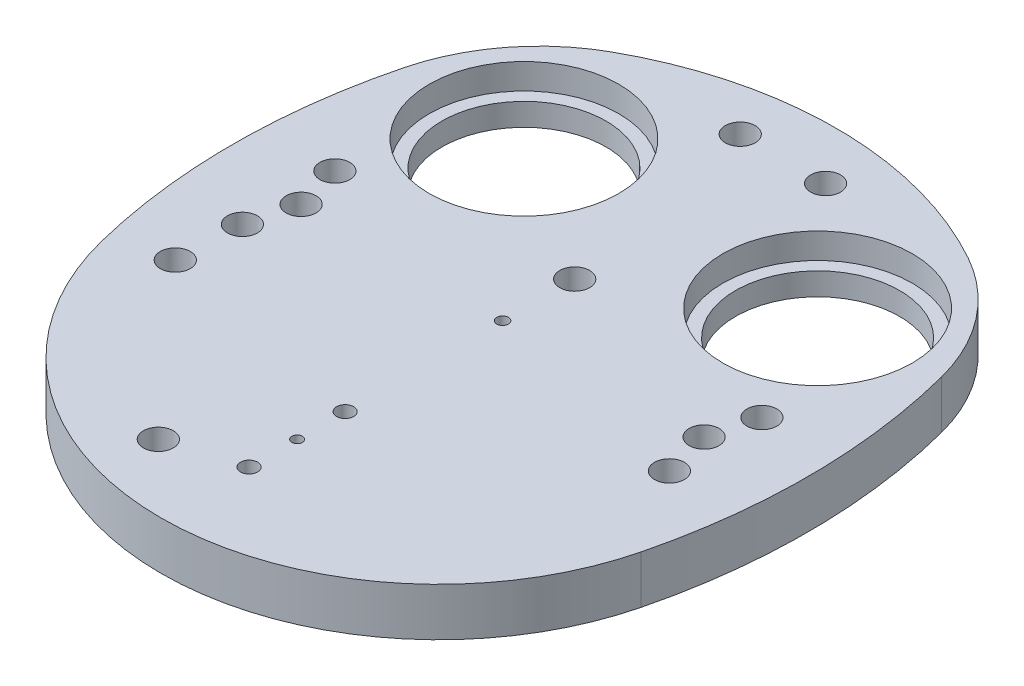
ISO-10303-21;
HEADER;
FILE_DESCRIPTION(('STEP AP214'),'2;1');
FILE_NAME('part.step','',(''),(''),'','','');
FILE_SCHEMA(('AUTOMOTIVE_DESIGN { 1 0 10303 214 1 1 1 1 }'));
ENDSEC;
DATA;
#1=APPLICATION_CONTEXT('core data for automotive mechanical design processes');
#2=APPLICATION_PROTOCOL_DEFINITION('international standard','automotive_design',2000,#1);
#3=PRODUCT_CONTEXT('',#1,'mechanical');
#4=PRODUCT('Part','Part','',(#3));
#5=PRODUCT_RELATED_PRODUCT_CATEGORY('part','',(#4));
#6=PRODUCT_DEFINITION_FORMATION('','',#4);
#7=PRODUCT_DEFINITION_CONTEXT('part definition',#1,'design');
#8=PRODUCT_DEFINITION('design','',#6,#7);
#9=PRODUCT_DEFINITION_SHAPE('','',#8);
#10=(LENGTH_UNIT() NAMED_UNIT(*) SI_UNIT(.MILLI.,.METRE.));
#11=(NAMED_UNIT(*) PLANE_ANGLE_UNIT() SI_UNIT($,.RADIAN.));
#12=(NAMED_UNIT(*) SI_UNIT($,.STERADIAN.) SOLID_ANGLE_UNIT());
#13=UNCERTAINTY_MEASURE_WITH_UNIT(LENGTH_MEASURE(1.E-05),#10,'distance_accuracy_value','');
#14=(GEOMETRIC_REPRESENTATION_CONTEXT(3) GLOBAL_UNCERTAINTY_ASSIGNED_CONTEXT((#13)) GLOBAL_UNIT_ASSIGNED_CONTEXT((#10,
#11,#12)) REPRESENTATION_CONTEXT('',''));
#15=CARTESIAN_POINT('',(0.,0.,0.));
#16=DIRECTION('',(0.,0.,1.));
#17=DIRECTION('',(1.,0.,0.));
#18=AXIS2_PLACEMENT_3D('',#15,#16,#17);
#19=CARTESIAN_POINT('',(-27.5,9.,0.));
#20=DIRECTION('',(0.,-1.,0.));
#21=DIRECTION('',(0.,0.,-1.));
#22=AXIS2_PLACEMENT_3D('',#19,#20,#21);
#23=CYLINDRICAL_SURFACE('',#22,17.75);
#24=CARTESIAN_POINT('',(-27.5,4.215,0.));
#25=DIRECTION('',(0.,1.,0.));
#26=DIRECTION('',(0.,0.,1.));
#27=AXIS2_PLACEMENT_3D('',#24,#25,#26);
#28=CIRCLE('',#27,17.75);
#29=CARTESIAN_POINT('',(-27.5,4.215,17.75));
#30=VERTEX_POINT('',#29);
#31=EDGE_CURVE('E80',#30,#30,#28,.T.);
#32=ORIENTED_EDGE('',*,*,#31,.F.);
#33=EDGE_LOOP('',(#32));
#34=FACE_BOUND('',#33,.T.);
#35=CARTESIAN_POINT('',(-27.5,9.,0.));
#36=DIRECTION('',(0.,1.,0.));
#37=DIRECTION('',(0.,0.,1.));
#38=AXIS2_PLACEMENT_3D('',#35,#36,#37);
#39=CIRCLE('',#38,17.75);
#40=CARTESIAN_POINT('',(-27.5,9.,17.75));
#41=VERTEX_POINT('',#40);
#42=EDGE_CURVE('E256',#41,#41,#39,.T.);
#43=ORIENTED_EDGE('',*,*,#42,.T.);
#44=EDGE_LOOP('',(#43));
#45=FACE_BOUND('',#44,.T.);
#46=ADVANCED_FACE('F71',(#34,#45),#23,.F.);
#47=CARTESIAN_POINT('',(27.5,9.,0.));
#48=DIRECTION('',(0.,-1.,0.));
#49=DIRECTION('',(0.,0.,-1.));
#50=AXIS2_PLACEMENT_3D('',#47,#48,#49);
#51=CYLINDRICAL_SURFACE('',#50,17.75);
#52=CARTESIAN_POINT('',(27.5,4.215,0.));
#53=DIRECTION('',(0.,1.,0.));
#54=DIRECTION('',(0.,0.,1.));
#55=AXIS2_PLACEMENT_3D('',#52,#53,#54);
#56=CIRCLE('',#55,17.75);
#57=CARTESIAN_POINT('',(27.5,4.215,17.75));
#58=VERTEX_POINT('',#57);
#59=EDGE_CURVE('E12',#58,#58,#56,.T.);
#60=ORIENTED_EDGE('',*,*,#59,.F.);
#61=EDGE_LOOP('',(#60));
#62=FACE_BOUND('',#61,.T.);
#63=CARTESIAN_POINT('',(27.5,9.,0.));
#64=DIRECTION('',(0.,1.,0.));
#65=DIRECTION('',(0.,0.,1.));
#66=AXIS2_PLACEMENT_3D('',#63,#64,#65);
#67=CIRCLE('',#66,17.75);
#68=CARTESIAN_POINT('',(27.5,9.,17.75));
#69=VERTEX_POINT('',#68);
#70=EDGE_CURVE('E261',#69,#69,#67,.T.);
#71=ORIENTED_EDGE('',*,*,#70,.T.);
#72=EDGE_LOOP('',(#71));
#73=FACE_BOUND('',#72,.T.);
#74=ADVANCED_FACE('F305',(#62,#73),#51,.F.);
#75=CARTESIAN_POINT('',(0.,9.,0.));
#76=DIRECTION('',(0.,1.,0.));
#77=DIRECTION('',(0.,0.,1.));
#78=AXIS2_PLACEMENT_3D('',#75,#76,#77);
#79=PLANE('',#78);
#80=CARTESIAN_POINT('',(0.,9.,31.5037951));
#81=DIRECTION('',(0.,1.,0.));
#82=DIRECTION('',(0.,0.,1.));
#83=AXIS2_PLACEMENT_3D('',#80,#81,#82);
#84=CIRCLE('',#83,1.1);
#85=CARTESIAN_POINT('',(0.,9.,32.6037951));
#86=VERTEX_POINT('',#85);
#87=EDGE_CURVE('E742',#86,#86,#84,.T.);
#88=ORIENTED_EDGE('',*,*,#87,.F.);
#89=EDGE_LOOP('',(#88));
#90=FACE_BOUND('',#89,.T.);
#91=CARTESIAN_POINT('',(0.,9.,79.));
#92=DIRECTION('',(0.,1.,0.));
#93=DIRECTION('',(0.,0.,1.));
#94=AXIS2_PLACEMENT_3D('',#91,#92,#93);
#95=CIRCLE('',#94,1.6);
#96=CARTESIAN_POINT('',(0.,9.,80.6));
#97=VERTEX_POINT('',#96);
#98=EDGE_CURVE('E744',#97,#97,#95,.T.);
#99=ORIENTED_EDGE('',*,*,#98,.F.);
#100=EDGE_LOOP('',(#99));
#101=FACE_BOUND('',#100,.T.);
#102=CARTESIAN_POINT('',(0.,9.,61.));
#103=DIRECTION('',(0.,1.,0.));
#104=DIRECTION('',(0.,0.,1.));
#105=AXIS2_PLACEMENT_3D('',#102,#103,#104);
#106=CIRCLE('',#105,1.6);
#107=CARTESIAN_POINT('',(0.,9.,62.6));
#108=VERTEX_POINT('',#107);
#109=EDGE_CURVE('E747',#108,#108,#106,.T.);
#110=ORIENTED_EDGE('',*,*,#109,.F.);
#111=EDGE_LOOP('',(#110));
#112=FACE_BOUND('',#111,.T.);
#113=CARTESIAN_POINT('',(0.,9.,70.));
#114=DIRECTION('',(0.,1.,0.));
#115=DIRECTION('',(0.,0.,1.));
#116=AXIS2_PLACEMENT_3D('',#113,#114,#115);
#117=CIRCLE('',#116,1.);
#118=CARTESIAN_POINT('',(0.,9.,71.));
#119=VERTEX_POINT('',#118);
#120=EDGE_CURVE('E269',#119,#119,#117,.T.);
#121=ORIENTED_EDGE('',*,*,#120,.F.);
#122=EDGE_LOOP('',(#121));
#123=FACE_BOUND('',#122,.T.);
#124=CARTESIAN_POINT('',(37.75,9.,31.5038));
#125=DIRECTION('',(0.,1.,0.));
#126=DIRECTION('',(0.,0.,-1.));
#127=AXIS2_PLACEMENT_3D('',#124,#125,#126);
#128=CIRCLE('',#127,2.8);
#129=CARTESIAN_POINT('',(37.75,9.,28.7038));
#130=VERTEX_POINT('',#129);
#131=EDGE_CURVE('E184',#130,#130,#128,.T.);
#132=ORIENTED_EDGE('',*,*,#131,.F.);
#133=EDGE_LOOP('',(#132));
#134=FACE_BOUND('',#133,.T.);
#135=CARTESIAN_POINT('',(-13.,9.,83.));
#136=DIRECTION('',(0.,1.,0.));
#137=DIRECTION('',(0.,0.,1.));
#138=AXIS2_PLACEMENT_3D('',#135,#136,#137);
#139=CIRCLE('',#138,2.8);
#140=CARTESIAN_POINT('',(-13.,9.,85.8));
#141=VERTEX_POINT('',#140);
#142=EDGE_CURVE('E209',#141,#141,#139,.T.);
#143=ORIENTED_EDGE('',*,*,#142,.F.);
#144=EDGE_LOOP('',(#143));
#145=FACE_BOUND('',#144,.T.);
#146=CARTESIAN_POINT('',(-40.5,9.,52.3285));
#147=DIRECTION('',(0.,1.,0.));
#148=DIRECTION('',(0.,0.,1.));
#149=AXIS2_PLACEMENT_3D('',#146,#147,#148);
#150=CIRCLE('',#149,2.8);
#151=CARTESIAN_POINT('',(-40.5,9.,55.1285));
#152=VERTEX_POINT('',#151);
#153=EDGE_CURVE('E203',#152,#152,#150,.T.);
#154=ORIENTED_EDGE('',*,*,#153,.F.);
#155=EDGE_LOOP('',(#154));
#156=FACE_BOUND('',#155,.T.);
#157=CARTESIAN_POINT('',(-40.,9.,40.255));
#158=DIRECTION('',(0.,1.,0.));
#159=DIRECTION('',(0.,0.,1.));
#160=AXIS2_PLACEMENT_3D('',#157,#158,#159);
#161=CIRCLE('',#160,2.8);
#162=CARTESIAN_POINT('',(-40.,9.,43.055));
#163=VERTEX_POINT('',#162);
#164=EDGE_CURVE('E197',#163,#163,#161,.T.);
#165=ORIENTED_EDGE('',*,*,#164,.F.);
#166=EDGE_LOOP('',(#165));
#167=FACE_BOUND('',#166,.T.);
#168=CARTESIAN_POINT('',(-37.75,9.,31.5038));
#169=DIRECTION('',(0.,1.,0.));
#170=DIRECTION('',(0.,0.,1.));
#171=AXIS2_PLACEMENT_3D('',#168,#169,#170);
#172=CIRCLE('',#171,2.8);
#173=CARTESIAN_POINT('',(-37.75,9.,34.3038));
#174=VERTEX_POINT('',#173);
#175=EDGE_CURVE('E196',#174,#174,#172,.T.);
#176=ORIENTED_EDGE('',*,*,#175,.F.);
#177=EDGE_LOOP('',(#176));
#178=FACE_BOUND('',#177,.T.);
#179=CARTESIAN_POINT('',(-40.,9.,22.9303));
#180=DIRECTION('',(0.,1.,0.));
#181=DIRECTION('',(0.,0.,1.));
#182=AXIS2_PLACEMENT_3D('',#179,#180,#181);
#183=CIRCLE('',#182,2.8);
#184=CARTESIAN_POINT('',(-40.,9.,25.7303));
#185=VERTEX_POINT('',#184);
#186=EDGE_CURVE('E233',#185,#185,#183,.T.);
#187=ORIENTED_EDGE('',*,*,#186,.F.);
#188=EDGE_LOOP('',(#187));
#189=FACE_BOUND('',#188,.T.);
#190=CARTESIAN_POINT('',(0.,9.,18.));
#191=DIRECTION('',(0.,1.,0.));
#192=DIRECTION('',(0.,0.,1.));
#193=AXIS2_PLACEMENT_3D('',#190,#191,#192);
#194=CIRCLE('',#193,2.8);
#195=CARTESIAN_POINT('',(0.,9.,20.8));
#196=VERTEX_POINT('',#195);
#197=EDGE_CURVE('E227',#196,#196,#194,.T.);
#198=ORIENTED_EDGE('',*,*,#197,.F.);
#199=EDGE_LOOP('',(#198));
#200=FACE_BOUND('',#199,.T.);
#201=CARTESIAN_POINT('',(40.,9.,40.255));
#202=DIRECTION('',(0.,1.,0.));
#203=DIRECTION('',(0.,0.,-1.));
#204=AXIS2_PLACEMENT_3D('',#201,#202,#203);
#205=CIRCLE('',#204,2.8);
#206=CARTESIAN_POINT('',(40.,9.,37.455));
#207=VERTEX_POINT('',#206);
#208=EDGE_CURVE('E221',#207,#207,#205,.T.);
#209=ORIENTED_EDGE('',*,*,#208,.F.);
#210=EDGE_LOOP('',(#209));
#211=FACE_BOUND('',#210,.T.);
#212=CARTESIAN_POINT('',(40.,9.,22.9303));
#213=DIRECTION('',(0.,1.,0.));
#214=DIRECTION('',(0.,0.,-1.));
#215=AXIS2_PLACEMENT_3D('',#212,#213,#214);
#216=CIRCLE('',#215,2.8);
#217=CARTESIAN_POINT('',(40.,9.,20.1303));
#218=VERTEX_POINT('',#217);
#219=EDGE_CURVE('E185',#218,#218,#216,.T.);
#220=ORIENTED_EDGE('',*,*,#219,.F.);
#221=EDGE_LOOP('',(#220));
#222=FACE_BOUND('',#221,.T.);
#223=CARTESIAN_POINT('',(8.,9.,-21.01));
#224=DIRECTION('',(0.,1.,0.));
#225=DIRECTION('',(0.,0.,-1.));
#226=AXIS2_PLACEMENT_3D('',#223,#224,#225);
#227=CIRCLE('',#226,2.8);
#228=CARTESIAN_POINT('',(8.,9.,-23.81));
#229=VERTEX_POINT('',#228);
#230=EDGE_CURVE('E174',#229,#229,#227,.T.);
#231=ORIENTED_EDGE('',*,*,#230,.F.);
#232=EDGE_LOOP('',(#231));
#233=FACE_BOUND('',#232,.T.);
#234=CARTESIAN_POINT('',(-8.,9.,-21.01));
#235=DIRECTION('',(0.,1.,0.));
#236=DIRECTION('',(0.,0.,1.));
#237=AXIS2_PLACEMENT_3D('',#234,#235,#236);
#238=CIRCLE('',#237,2.8);
#239=CARTESIAN_POINT('',(-8.,9.,-18.21));
#240=VERTEX_POINT('',#239);
#241=EDGE_CURVE('E220',#240,#240,#238,.T.);
#242=ORIENTED_EDGE('',*,*,#241,.F.);
#243=EDGE_LOOP('',(#242));
#244=FACE_BOUND('',#243,.T.);
#245=ORIENTED_EDGE('',*,*,#42,.F.);
#246=EDGE_LOOP('',(#245));
#247=FACE_BOUND('',#246,.T.);
#248=ORIENTED_EDGE('',*,*,#70,.F.);
#249=EDGE_LOOP('',(#248));
#250=FACE_BOUND('',#249,.T.);
#251=CARTESIAN_POINT('',(16.3604303599997,9.,8.27429786000026));
#252=DIRECTION('',(0.,1.,0.));
#253=DIRECTION('',(0.,0.,1.));
#254=AXIS2_PLACEMENT_3D('',#251,#252,#253);
#255=CIRCLE('',#254,35.);
#256=CARTESIAN_POINT('',(50.2516766967729,9.,-0.465463105847257));
#257=VERTEX_POINT('',#256);
#258=CARTESIAN_POINT('',(33.3942075342507,9.,-22.3010260986753));
#259=VERTEX_POINT('',#258);
#260=EDGE_CURVE('E158',#257,#259,#255,.T.);
#261=ORIENTED_EDGE('',*,*,#260,.T.);
#262=CARTESIAN_POINT('',(0.,9.,37.6409763860358));
#263=DIRECTION('',(0.,-1.,0.));
#264=DIRECTION('',(0.,0.,-1.));
#265=AXIS2_PLACEMENT_3D('',#262,#263,#264);
#266=CIRCLE('',#265,68.6164467071686);
#267=CARTESIAN_POINT('',(-33.3942075342507,9.,-22.3010260986753));
#268=VERTEX_POINT('',#267);
#269=EDGE_CURVE('E161',#268,#259,#266,.T.);
#270=ORIENTED_EDGE('',*,*,#269,.F.);
#271=CARTESIAN_POINT('',(-16.36043036,9.,8.27429786));
#272=DIRECTION('',(0.,-1.,0.));
#273=DIRECTION('',(0.,0.,-1.));
#274=AXIS2_PLACEMENT_3D('',#271,#272,#273);
#275=CIRCLE('',#274,34.9999999999996);
#276=CARTESIAN_POINT('',(-50.2516766967729,9.,-0.465463105847306));
#277=VERTEX_POINT('',#276);
#278=EDGE_CURVE('E165',#277,#268,#275,.T.);
#279=ORIENTED_EDGE('',*,*,#278,.F.);
#280=CARTESIAN_POINT('',(61.1312277841907,9.,28.2575868278222));
#281=DIRECTION('',(0.,1.,0.));
#282=DIRECTION('',(0.,0.,1.));
#283=AXIS2_PLACEMENT_3D('',#280,#281,#282);
#284=CIRCLE('',#283,115.02680126);
#285=CARTESIAN_POINT('',(-50.4907108423615,9.,56.0372165114184));
#286=VERTEX_POINT('',#285);
#287=EDGE_CURVE('E167',#277,#286,#284,.T.);
#288=ORIENTED_EDGE('',*,*,#287,.T.);
#289=CARTESIAN_POINT('',(0.,9.,43.4714676369521));
#290=DIRECTION('',(0.,1.,0.));
#291=DIRECTION('',(0.,0.,1.));
#292=AXIS2_PLACEMENT_3D('',#289,#290,#291);
#293=CIRCLE('',#292,52.03085552);
#294=CARTESIAN_POINT('',(50.4907108423616,9.,56.0372165114184));
#295=VERTEX_POINT('',#294);
#296=EDGE_CURVE('E137',#286,#295,#293,.T.);
#297=ORIENTED_EDGE('',*,*,#296,.T.);
#298=CARTESIAN_POINT('',(-61.1312277841907,9.,28.2575868278222));
#299=DIRECTION('',(0.,-1.,0.));
#300=DIRECTION('',(0.,0.,-1.));
#301=AXIS2_PLACEMENT_3D('',#298,#299,#300);
#302=CIRCLE('',#301,115.02680126);
#303=EDGE_CURVE('E170',#257,#295,#302,.T.);
#304=ORIENTED_EDGE('',*,*,#303,.F.);
#305=EDGE_LOOP('',(#261,#270,#279,#288,#297,#304));
#306=FACE_BOUND('',#305,.T.);
#307=ADVANCED_FACE('F292',(#90,#101,#112,#123,#134,#145,#156,#167,#178,#189,#200,#211,#222,#233,
#244,#247,#250,#306),#79,.T.);
#308=CARTESIAN_POINT('',(0.,0.,0.));
#309=DIRECTION('',(0.,1.,0.));
#310=DIRECTION('',(0.,0.,1.));
#311=AXIS2_PLACEMENT_3D('',#308,#309,#310);
#312=PLANE('',#311);
#313=CARTESIAN_POINT('',(0.,0.,31.5037951));
#314=DIRECTION('',(0.,1.,0.));
#315=DIRECTION('',(0.,0.,1.));
#316=AXIS2_PLACEMENT_3D('',#313,#314,#315);
#317=CIRCLE('',#316,1.1);
#318=CARTESIAN_POINT('',(0.,0.,32.6037951));
#319=VERTEX_POINT('',#318);
#320=EDGE_CURVE('E740',#319,#319,#317,.T.);
#321=ORIENTED_EDGE('',*,*,#320,.T.);
#322=EDGE_LOOP('',(#321));
#323=FACE_BOUND('',#322,.T.);
#324=CARTESIAN_POINT('',(0.,0.,70.));
#325=DIRECTION('',(0.,1.,0.));
#326=DIRECTION('',(0.,0.,1.));
#327=AXIS2_PLACEMENT_3D('',#324,#325,#326);
#328=CIRCLE('',#327,15.25);
#329=CARTESIAN_POINT('',(0.,0.,85.25));
#330=VERTEX_POINT('',#329);
#331=EDGE_CURVE('E162',#330,#330,#328,.T.);
#332=ORIENTED_EDGE('',*,*,#331,.T.);
#333=EDGE_LOOP('',(#332));
#334=FACE_BOUND('',#333,.T.);
#335=CARTESIAN_POINT('',(27.5,0.,0.));
#336=DIRECTION('',(0.,1.,0.));
#337=DIRECTION('',(0.,0.,1.));
#338=AXIS2_PLACEMENT_3D('',#335,#336,#337);
#339=CIRCLE('',#338,15.375);
#340=CARTESIAN_POINT('',(27.5,0.,15.375));
#341=VERTEX_POINT('',#340);
#342=EDGE_CURVE('E244',#341,#341,#339,.T.);
#343=ORIENTED_EDGE('',*,*,#342,.T.);
#344=EDGE_LOOP('',(#343));
#345=FACE_BOUND('',#344,.T.);
#346=CARTESIAN_POINT('',(-27.5,0.,0.));
#347=DIRECTION('',(0.,1.,0.));
#348=DIRECTION('',(0.,0.,1.));
#349=AXIS2_PLACEMENT_3D('',#346,#347,#348);
#350=CIRCLE('',#349,15.375);
#351=CARTESIAN_POINT('',(-27.5,0.,15.375));
#352=VERTEX_POINT('',#351);
#353=EDGE_CURVE('E250',#352,#352,#350,.T.);
#354=ORIENTED_EDGE('',*,*,#353,.T.);
#355=EDGE_LOOP('',(#354));
#356=FACE_BOUND('',#355,.T.);
#357=CARTESIAN_POINT('',(16.3604303599997,0.,8.27429786000026));
#358=DIRECTION('',(0.,1.,0.));
#359=DIRECTION('',(0.,0.,1.));
#360=AXIS2_PLACEMENT_3D('',#357,#358,#359);
#361=CIRCLE('',#360,35.);
#362=CARTESIAN_POINT('',(50.2516766967729,0.,-0.465463105847257));
#363=VERTEX_POINT('',#362);
#364=CARTESIAN_POINT('',(33.3942075342507,0.,-22.3010260986753));
#365=VERTEX_POINT('',#364);
#366=EDGE_CURVE('E172',#363,#365,#361,.T.);
#367=ORIENTED_EDGE('',*,*,#366,.F.);
#368=CARTESIAN_POINT('',(-61.1312277841907,0.,28.2575868278222));
#369=DIRECTION('',(0.,-1.,0.));
#370=DIRECTION('',(0.,0.,-1.));
#371=AXIS2_PLACEMENT_3D('',#368,#369,#370);
#372=CIRCLE('',#371,115.02680126);
#373=CARTESIAN_POINT('',(50.4907108423616,0.,56.0372165114184));
#374=VERTEX_POINT('',#373);
#375=EDGE_CURVE('E147',#363,#374,#372,.T.);
#376=ORIENTED_EDGE('',*,*,#375,.T.);
#377=CARTESIAN_POINT('',(0.,0.,43.4714676369521));
#378=DIRECTION('',(0.,1.,0.));
#379=DIRECTION('',(0.,0.,1.));
#380=AXIS2_PLACEMENT_3D('',#377,#378,#379);
#381=CIRCLE('',#380,52.03085552);
#382=CARTESIAN_POINT('',(-50.4907108423615,0.,56.0372165114184));
#383=VERTEX_POINT('',#382);
#384=EDGE_CURVE('E135',#383,#374,#381,.T.);
#385=ORIENTED_EDGE('',*,*,#384,.F.);
#386=CARTESIAN_POINT('',(61.1312277841907,0.,28.2575868278222));
#387=DIRECTION('',(0.,1.,0.));
#388=DIRECTION('',(0.,0.,1.));
#389=AXIS2_PLACEMENT_3D('',#386,#387,#388);
#390=CIRCLE('',#389,115.02680126);
#391=CARTESIAN_POINT('',(-50.2516766967729,0.,-0.465463105847306));
#392=VERTEX_POINT('',#391);
#393=EDGE_CURVE('E146',#392,#383,#390,.T.);
#394=ORIENTED_EDGE('',*,*,#393,.F.);
#395=CARTESIAN_POINT('',(-16.36043036,0.,8.27429786));
#396=DIRECTION('',(0.,-1.,0.));
#397=DIRECTION('',(0.,0.,-1.));
#398=AXIS2_PLACEMENT_3D('',#395,#396,#397);
#399=CIRCLE('',#398,34.9999999999996);
#400=CARTESIAN_POINT('',(-33.3942075342507,0.,-22.3010260986753));
#401=VERTEX_POINT('',#400);
#402=EDGE_CURVE('E151',#392,#401,#399,.T.);
#403=ORIENTED_EDGE('',*,*,#402,.T.);
#404=CARTESIAN_POINT('',(0.,0.,37.6409763860358));
#405=DIRECTION('',(0.,-1.,0.));
#406=DIRECTION('',(0.,0.,-1.));
#407=AXIS2_PLACEMENT_3D('',#404,#405,#406);
#408=CIRCLE('',#407,68.6164467071686);
#409=EDGE_CURVE('E125',#401,#365,#408,.T.);
#410=ORIENTED_EDGE('',*,*,#409,.T.);
#411=EDGE_LOOP('',(#367,#376,#385,#394,#403,#410));
#412=FACE_BOUND('',#411,.T.);
#413=ADVANCED_FACE('F145',(#323,#334,#345,#356,#412),#312,.F.);
#414=CARTESIAN_POINT('',(-27.5,4.215,0.));
#415=DIRECTION('',(0.,1.,0.));
#416=DIRECTION('',(0.,0.,1.));
#417=AXIS2_PLACEMENT_3D('',#414,#415,#416);
#418=PLANE('',#417);
#419=ORIENTED_EDGE('',*,*,#31,.T.);
#420=EDGE_LOOP('',(#419));
#421=FACE_BOUND('',#420,.T.);
#422=CARTESIAN_POINT('',(-27.5,4.215,0.));
#423=DIRECTION('',(0.,1.,0.));
#424=DIRECTION('',(0.,0.,1.));
#425=AXIS2_PLACEMENT_3D('',#422,#423,#424);
#426=CIRCLE('',#425,15.375);
#427=CARTESIAN_POINT('',(-27.5,4.215,15.375));
#428=VERTEX_POINT('',#427);
#429=EDGE_CURVE('E253',#428,#428,#426,.T.);
#430=ORIENTED_EDGE('',*,*,#429,.F.);
#431=EDGE_LOOP('',(#430));
#432=FACE_BOUND('',#431,.T.);
#433=ADVANCED_FACE('F325',(#421,#432),#418,.T.);
#434=CARTESIAN_POINT('',(-27.5,4.215,0.));
#435=DIRECTION('',(0.,-1.,0.));
#436=DIRECTION('',(0.,0.,-1.));
#437=AXIS2_PLACEMENT_3D('',#434,#435,#436);
#438=CYLINDRICAL_SURFACE('',#437,15.375);
#439=ORIENTED_EDGE('',*,*,#429,.T.);
#440=EDGE_LOOP('',(#439));
#441=FACE_BOUND('',#440,.T.);
#442=ORIENTED_EDGE('',*,*,#353,.F.);
#443=EDGE_LOOP('',(#442));
#444=FACE_BOUND('',#443,.T.);
#445=ADVANCED_FACE('F333',(#441,#444),#438,.F.);
#446=CARTESIAN_POINT('',(27.5,4.215,0.));
#447=DIRECTION('',(0.,1.,0.));
#448=DIRECTION('',(0.,0.,1.));
#449=AXIS2_PLACEMENT_3D('',#446,#447,#448);
#450=PLANE('',#449);
#451=ORIENTED_EDGE('',*,*,#59,.T.);
#452=EDGE_LOOP('',(#451));
#453=FACE_BOUND('',#452,.T.);
#454=CARTESIAN_POINT('',(27.5,4.215,0.));
#455=DIRECTION('',(0.,1.,0.));
#456=DIRECTION('',(0.,0.,1.));
#457=AXIS2_PLACEMENT_3D('',#454,#455,#456);
#458=CIRCLE('',#457,15.375);
#459=CARTESIAN_POINT('',(27.5,4.215,15.375));
#460=VERTEX_POINT('',#459);
#461=EDGE_CURVE('E247',#460,#460,#458,.T.);
#462=ORIENTED_EDGE('',*,*,#461,.F.);
#463=EDGE_LOOP('',(#462));
#464=FACE_BOUND('',#463,.T.);
#465=ADVANCED_FACE('F337',(#453,#464),#450,.T.);
#466=CARTESIAN_POINT('',(27.5,4.215,0.));
#467=DIRECTION('',(0.,-1.,0.));
#468=DIRECTION('',(0.,0.,-1.));
#469=AXIS2_PLACEMENT_3D('',#466,#467,#468);
#470=CYLINDRICAL_SURFACE('',#469,15.375);
#471=ORIENTED_EDGE('',*,*,#461,.T.);
#472=EDGE_LOOP('',(#471));
#473=FACE_BOUND('',#472,.T.);
#474=ORIENTED_EDGE('',*,*,#342,.F.);
#475=EDGE_LOOP('',(#474));
#476=FACE_BOUND('',#475,.T.);
#477=ADVANCED_FACE('F341',(#473,#476),#470,.F.);
#478=CARTESIAN_POINT('',(-8.,2.,-21.01));
#479=DIRECTION('',(0.,1.,0.));
#480=DIRECTION('',(0.,0.,1.));
#481=AXIS2_PLACEMENT_3D('',#478,#479,#480);
#482=CYLINDRICAL_SURFACE('',#481,2.8);
#483=CARTESIAN_POINT('',(-8.,2.,-21.01));
#484=DIRECTION('',(0.,1.,0.));
#485=DIRECTION('',(0.,0.,1.));
#486=AXIS2_PLACEMENT_3D('',#483,#484,#485);
#487=CIRCLE('',#486,2.8);
#488=CARTESIAN_POINT('',(-8.,2.,-18.21));
#489=VERTEX_POINT('',#488);
#490=EDGE_CURVE('E241',#489,#489,#487,.T.);
#491=ORIENTED_EDGE('',*,*,#490,.F.);
#492=EDGE_LOOP('',(#491));
#493=FACE_BOUND('',#492,.T.);
#494=ORIENTED_EDGE('',*,*,#241,.T.);
#495=EDGE_LOOP('',(#494));
#496=FACE_BOUND('',#495,.T.);
#497=ADVANCED_FACE('F345',(#493,#496),#482,.F.);
#498=CARTESIAN_POINT('',(-8.,2.,-21.01));
#499=DIRECTION('',(0.,1.,0.));
#500=DIRECTION('',(0.,0.,1.));
#501=AXIS2_PLACEMENT_3D('',#498,#499,#500);
#502=PLANE('',#501);
#503=ORIENTED_EDGE('',*,*,#490,.T.);
#504=EDGE_LOOP('',(#503));
#505=FACE_BOUND('',#504,.T.);
#506=ADVANCED_FACE('F349',(#505),#502,.T.);
#507=CARTESIAN_POINT('',(8.,2.,-21.01));
#508=DIRECTION('',(0.,1.,0.));
#509=DIRECTION('',(0.,0.,1.));
#510=AXIS2_PLACEMENT_3D('',#507,#508,#509);
#511=CYLINDRICAL_SURFACE('',#510,2.8);
#512=CARTESIAN_POINT('',(8.,2.,-21.01));
#513=DIRECTION('',(0.,1.,0.));
#514=DIRECTION('',(0.,0.,-1.));
#515=AXIS2_PLACEMENT_3D('',#512,#513,#514);
#516=CIRCLE('',#515,2.8);
#517=CARTESIAN_POINT('',(8.,2.,-23.81));
#518=VERTEX_POINT('',#517);
#519=EDGE_CURVE('E188',#518,#518,#516,.T.);
#520=ORIENTED_EDGE('',*,*,#519,.F.);
#521=EDGE_LOOP('',(#520));
#522=FACE_BOUND('',#521,.T.);
#523=ORIENTED_EDGE('',*,*,#230,.T.);
#524=EDGE_LOOP('',(#523));
#525=FACE_BOUND('',#524,.T.);
#526=ADVANCED_FACE('F353',(#522,#525),#511,.F.);
#527=CARTESIAN_POINT('',(8.,2.,-21.01));
#528=DIRECTION('',(0.,-1.,0.));
#529=DIRECTION('',(0.,0.,-1.));
#530=AXIS2_PLACEMENT_3D('',#527,#528,#529);
#531=PLANE('',#530);
#532=ORIENTED_EDGE('',*,*,#519,.T.);
#533=EDGE_LOOP('',(#532));
#534=FACE_BOUND('',#533,.T.);
#535=ADVANCED_FACE('F421',(#534),#531,.F.);
#536=CARTESIAN_POINT('',(40.,2.,22.9303));
#537=DIRECTION('',(0.,1.,0.));
#538=DIRECTION('',(0.,0.,1.));
#539=AXIS2_PLACEMENT_3D('',#536,#537,#538);
#540=CYLINDRICAL_SURFACE('',#539,2.8);
#541=CARTESIAN_POINT('',(40.,2.,22.9303));
#542=DIRECTION('',(0.,1.,0.));
#543=DIRECTION('',(0.,0.,-1.));
#544=AXIS2_PLACEMENT_3D('',#541,#542,#543);
#545=CIRCLE('',#544,2.8);
#546=CARTESIAN_POINT('',(40.,2.,20.1303));
#547=VERTEX_POINT('',#546);
#548=EDGE_CURVE('E181',#547,#547,#545,.T.);
#549=ORIENTED_EDGE('',*,*,#548,.F.);
#550=EDGE_LOOP('',(#549));
#551=FACE_BOUND('',#550,.T.);
#552=ORIENTED_EDGE('',*,*,#219,.T.);
#553=EDGE_LOOP('',(#552));
#554=FACE_BOUND('',#553,.T.);
#555=ADVANCED_FACE('F425',(#551,#554),#540,.F.);
#556=CARTESIAN_POINT('',(40.,2.,22.9303));
#557=DIRECTION('',(0.,-1.,0.));
#558=DIRECTION('',(0.,0.,-1.));
#559=AXIS2_PLACEMENT_3D('',#556,#557,#558);
#560=PLANE('',#559);
#561=ORIENTED_EDGE('',*,*,#548,.T.);
#562=EDGE_LOOP('',(#561));
#563=FACE_BOUND('',#562,.T.);
#564=ADVANCED_FACE('F384',(#563),#560,.F.);
#565=CARTESIAN_POINT('',(40.,2.,40.255));
#566=DIRECTION('',(0.,1.,0.));
#567=DIRECTION('',(0.,0.,1.));
#568=AXIS2_PLACEMENT_3D('',#565,#566,#567);
#569=CYLINDRICAL_SURFACE('',#568,2.8);
#570=CARTESIAN_POINT('',(40.,2.,40.255));
#571=DIRECTION('',(0.,1.,0.));
#572=DIRECTION('',(0.,0.,-1.));
#573=AXIS2_PLACEMENT_3D('',#570,#571,#572);
#574=CIRCLE('',#573,2.8);
#575=CARTESIAN_POINT('',(40.,2.,37.455));
#576=VERTEX_POINT('',#575);
#577=EDGE_CURVE('E217',#576,#576,#574,.T.);
#578=ORIENTED_EDGE('',*,*,#577,.F.);
#579=EDGE_LOOP('',(#578));
#580=FACE_BOUND('',#579,.T.);
#581=ORIENTED_EDGE('',*,*,#208,.T.);
#582=EDGE_LOOP('',(#581));
#583=FACE_BOUND('',#582,.T.);
#584=ADVANCED_FACE('F381',(#580,#583),#569,.F.);
#585=CARTESIAN_POINT('',(40.,2.,40.255));
#586=DIRECTION('',(0.,-1.,0.));
#587=DIRECTION('',(0.,0.,-1.));
#588=AXIS2_PLACEMENT_3D('',#585,#586,#587);
#589=PLANE('',#588);
#590=ORIENTED_EDGE('',*,*,#577,.T.);
#591=EDGE_LOOP('',(#590));
#592=FACE_BOUND('',#591,.T.);
#593=ADVANCED_FACE('F376',(#592),#589,.F.);
#594=CARTESIAN_POINT('',(0.,2.,18.));
#595=DIRECTION('',(0.,1.,0.));
#596=DIRECTION('',(0.,0.,1.));
#597=AXIS2_PLACEMENT_3D('',#594,#595,#596);
#598=CYLINDRICAL_SURFACE('',#597,2.8);
#599=CARTESIAN_POINT('',(0.,2.,18.));
#600=DIRECTION('',(0.,1.,0.));
#601=DIRECTION('',(0.,0.,1.));
#602=AXIS2_PLACEMENT_3D('',#599,#600,#601);
#603=CIRCLE('',#602,2.8);
#604=CARTESIAN_POINT('',(0.,2.,20.8));
#605=VERTEX_POINT('',#604);
#606=EDGE_CURVE('E224',#605,#605,#603,.T.);
#607=ORIENTED_EDGE('',*,*,#606,.F.);
#608=EDGE_LOOP('',(#607));
#609=FACE_BOUND('',#608,.T.);
#610=ORIENTED_EDGE('',*,*,#197,.T.);
#611=EDGE_LOOP('',(#610));
#612=FACE_BOUND('',#611,.T.);
#613=ADVANCED_FACE('F373',(#609,#612),#598,.F.);
#614=CARTESIAN_POINT('',(0.,2.,18.));
#615=DIRECTION('',(0.,1.,0.));
#616=DIRECTION('',(0.,0.,1.));
#617=AXIS2_PLACEMENT_3D('',#614,#615,#616);
#618=PLANE('',#617);
#619=ORIENTED_EDGE('',*,*,#606,.T.);
#620=EDGE_LOOP('',(#619));
#621=FACE_BOUND('',#620,.T.);
#622=ADVANCED_FACE('F368',(#621),#618,.T.);
#623=CARTESIAN_POINT('',(-40.,2.,22.9303));
#624=DIRECTION('',(0.,1.,0.));
#625=DIRECTION('',(0.,0.,1.));
#626=AXIS2_PLACEMENT_3D('',#623,#624,#625);
#627=CYLINDRICAL_SURFACE('',#626,2.8);
#628=CARTESIAN_POINT('',(-40.,2.,22.9303));
#629=DIRECTION('',(0.,1.,0.));
#630=DIRECTION('',(0.,0.,1.));
#631=AXIS2_PLACEMENT_3D('',#628,#629,#630);
#632=CIRCLE('',#631,2.8);
#633=CARTESIAN_POINT('',(-40.,2.,25.7303));
#634=VERTEX_POINT('',#633);
#635=EDGE_CURVE('E230',#634,#634,#632,.T.);
#636=ORIENTED_EDGE('',*,*,#635,.F.);
#637=EDGE_LOOP('',(#636));
#638=FACE_BOUND('',#637,.T.);
#639=ORIENTED_EDGE('',*,*,#186,.T.);
#640=EDGE_LOOP('',(#639));
#641=FACE_BOUND('',#640,.T.);
#642=ADVANCED_FACE('F365',(#638,#641),#627,.F.);
#643=CARTESIAN_POINT('',(-40.,2.,22.9303));
#644=DIRECTION('',(0.,1.,0.));
#645=DIRECTION('',(0.,0.,1.));
#646=AXIS2_PLACEMENT_3D('',#643,#644,#645);
#647=PLANE('',#646);
#648=ORIENTED_EDGE('',*,*,#635,.T.);
#649=EDGE_LOOP('',(#648));
#650=FACE_BOUND('',#649,.T.);
#651=ADVANCED_FACE('F359',(#650),#647,.T.);
#652=CARTESIAN_POINT('',(-37.75,2.,31.5038));
#653=DIRECTION('',(0.,1.,0.));
#654=DIRECTION('',(0.,0.,1.));
#655=AXIS2_PLACEMENT_3D('',#652,#653,#654);
#656=CYLINDRICAL_SURFACE('',#655,2.8);
#657=CARTESIAN_POINT('',(-37.75,2.,31.5038));
#658=DIRECTION('',(0.,1.,0.));
#659=DIRECTION('',(0.,0.,1.));
#660=AXIS2_PLACEMENT_3D('',#657,#658,#659);
#661=CIRCLE('',#660,2.8);
#662=CARTESIAN_POINT('',(-37.75,2.,34.3038));
#663=VERTEX_POINT('',#662);
#664=EDGE_CURVE('E236',#663,#663,#661,.T.);
#665=ORIENTED_EDGE('',*,*,#664,.F.);
#666=EDGE_LOOP('',(#665));
#667=FACE_BOUND('',#666,.T.);
#668=ORIENTED_EDGE('',*,*,#175,.T.);
#669=EDGE_LOOP('',(#668));
#670=FACE_BOUND('',#669,.T.);
#671=ADVANCED_FACE('F355',(#667,#670),#656,.F.);
#672=CARTESIAN_POINT('',(-37.75,2.,31.5038));
#673=DIRECTION('',(0.,1.,0.));
#674=DIRECTION('',(0.,0.,1.));
#675=AXIS2_PLACEMENT_3D('',#672,#673,#674);
#676=PLANE('',#675);
#677=ORIENTED_EDGE('',*,*,#664,.T.);
#678=EDGE_LOOP('',(#677));
#679=FACE_BOUND('',#678,.T.);
#680=ADVANCED_FACE('F358',(#679),#676,.T.);
#681=CARTESIAN_POINT('',(-40.,2.,40.255));
#682=DIRECTION('',(0.,1.,0.));
#683=DIRECTION('',(0.,0.,1.));
#684=AXIS2_PLACEMENT_3D('',#681,#682,#683);
#685=CYLINDRICAL_SURFACE('',#684,2.8);
#686=CARTESIAN_POINT('',(-40.,2.,40.255));
#687=DIRECTION('',(0.,1.,0.));
#688=DIRECTION('',(0.,0.,1.));
#689=AXIS2_PLACEMENT_3D('',#686,#687,#688);
#690=CIRCLE('',#689,2.8);
#691=CARTESIAN_POINT('',(-40.,2.,43.055));
#692=VERTEX_POINT('',#691);
#693=EDGE_CURVE('E193',#692,#692,#690,.T.);
#694=ORIENTED_EDGE('',*,*,#693,.F.);
#695=EDGE_LOOP('',(#694));
#696=FACE_BOUND('',#695,.T.);
#697=ORIENTED_EDGE('',*,*,#164,.T.);
#698=EDGE_LOOP('',(#697));
#699=FACE_BOUND('',#698,.T.);
#700=ADVANCED_FACE('F363',(#696,#699),#685,.F.);
#701=CARTESIAN_POINT('',(-40.,2.,40.255));
#702=DIRECTION('',(0.,1.,0.));
#703=DIRECTION('',(0.,0.,1.));
#704=AXIS2_PLACEMENT_3D('',#701,#702,#703);
#705=PLANE('',#704);
#706=ORIENTED_EDGE('',*,*,#693,.T.);
#707=EDGE_LOOP('',(#706));
#708=FACE_BOUND('',#707,.T.);
#709=ADVANCED_FACE('F408',(#708),#705,.T.);
#710=CARTESIAN_POINT('',(-40.5,2.,52.3285));
#711=DIRECTION('',(0.,1.,0.));
#712=DIRECTION('',(0.,0.,1.));
#713=AXIS2_PLACEMENT_3D('',#710,#711,#712);
#714=CYLINDRICAL_SURFACE('',#713,2.8);
#715=CARTESIAN_POINT('',(-40.5,2.,52.3285));
#716=DIRECTION('',(0.,1.,0.));
#717=DIRECTION('',(0.,0.,1.));
#718=AXIS2_PLACEMENT_3D('',#715,#716,#717);
#719=CIRCLE('',#718,2.8);
#720=CARTESIAN_POINT('',(-40.5,2.,55.1285));
#721=VERTEX_POINT('',#720);
#722=EDGE_CURVE('E200',#721,#721,#719,.T.);
#723=ORIENTED_EDGE('',*,*,#722,.F.);
#724=EDGE_LOOP('',(#723));
#725=FACE_BOUND('',#724,.T.);
#726=ORIENTED_EDGE('',*,*,#153,.T.);
#727=EDGE_LOOP('',(#726));
#728=FACE_BOUND('',#727,.T.);
#729=ADVANCED_FACE('F405',(#725,#728),#714,.F.);
#730=CARTESIAN_POINT('',(-40.5,2.,52.3285));
#731=DIRECTION('',(0.,1.,0.));
#732=DIRECTION('',(0.,0.,1.));
#733=AXIS2_PLACEMENT_3D('',#730,#731,#732);
#734=PLANE('',#733);
#735=ORIENTED_EDGE('',*,*,#722,.T.);
#736=EDGE_LOOP('',(#735));
#737=FACE_BOUND('',#736,.T.);
#738=ADVANCED_FACE('F400',(#737),#734,.T.);
#739=CARTESIAN_POINT('',(-13.,2.,83.));
#740=DIRECTION('',(0.,1.,0.));
#741=DIRECTION('',(0.,0.,1.));
#742=AXIS2_PLACEMENT_3D('',#739,#740,#741);
#743=CYLINDRICAL_SURFACE('',#742,2.8);
#744=CARTESIAN_POINT('',(-13.,2.,83.));
#745=DIRECTION('',(0.,1.,0.));
#746=DIRECTION('',(0.,0.,1.));
#747=AXIS2_PLACEMENT_3D('',#744,#745,#746);
#748=CIRCLE('',#747,2.8);
#749=CARTESIAN_POINT('',(-13.,2.,85.8));
#750=VERTEX_POINT('',#749);
#751=EDGE_CURVE('E206',#750,#750,#748,.T.);
#752=ORIENTED_EDGE('',*,*,#751,.F.);
#753=EDGE_LOOP('',(#752));
#754=FACE_BOUND('',#753,.T.);
#755=ORIENTED_EDGE('',*,*,#142,.T.);
#756=EDGE_LOOP('',(#755));
#757=FACE_BOUND('',#756,.T.);
#758=ADVANCED_FACE('F397',(#754,#757),#743,.F.);
#759=CARTESIAN_POINT('',(-13.,2.,83.));
#760=DIRECTION('',(0.,1.,0.));
#761=DIRECTION('',(0.,0.,1.));
#762=AXIS2_PLACEMENT_3D('',#759,#760,#761);
#763=PLANE('',#762);
#764=ORIENTED_EDGE('',*,*,#751,.T.);
#765=EDGE_LOOP('',(#764));
#766=FACE_BOUND('',#765,.T.);
#767=ADVANCED_FACE('F392',(#766),#763,.T.);
#768=CARTESIAN_POINT('',(37.75,2.,31.5038));
#769=DIRECTION('',(0.,1.,0.));
#770=DIRECTION('',(0.,0.,1.));
#771=AXIS2_PLACEMENT_3D('',#768,#769,#770);
#772=CYLINDRICAL_SURFACE('',#771,2.8);
#773=CARTESIAN_POINT('',(37.75,2.,31.5038));
#774=DIRECTION('',(0.,1.,0.));
#775=DIRECTION('',(0.,0.,-1.));
#776=AXIS2_PLACEMENT_3D('',#773,#774,#775);
#777=CIRCLE('',#776,2.8);
#778=CARTESIAN_POINT('',(37.75,2.,28.7038));
#779=VERTEX_POINT('',#778);
#780=EDGE_CURVE('E212',#779,#779,#777,.T.);
#781=ORIENTED_EDGE('',*,*,#780,.F.);
#782=EDGE_LOOP('',(#781));
#783=FACE_BOUND('',#782,.T.);
#784=ORIENTED_EDGE('',*,*,#131,.T.);
#785=EDGE_LOOP('',(#784));
#786=FACE_BOUND('',#785,.T.);
#787=ADVANCED_FACE('F389',(#783,#786),#772,.F.);
#788=CARTESIAN_POINT('',(37.75,2.,31.5038));
#789=DIRECTION('',(0.,-1.,0.));
#790=DIRECTION('',(0.,0.,-1.));
#791=AXIS2_PLACEMENT_3D('',#788,#789,#790);
#792=PLANE('',#791);
#793=ORIENTED_EDGE('',*,*,#780,.T.);
#794=EDGE_LOOP('',(#793));
#795=FACE_BOUND('',#794,.T.);
#796=ADVANCED_FACE('F301',(#795),#792,.F.);
#797=CARTESIAN_POINT('',(16.3604303599997,0.,8.27429786000026));
#798=DIRECTION('',(0.,1.,0.));
#799=DIRECTION('',(0.,0.,1.));
#800=AXIS2_PLACEMENT_3D('',#797,#798,#799);
#801=CYLINDRICAL_SURFACE('',#800,35.);
#802=ORIENTED_EDGE('',*,*,#260,.F.);
#803=DIRECTION('',(0.,1.,0.));
#804=VECTOR('',#803,1.);
#805=CARTESIAN_POINT('',(50.2516766967729,0.,-0.465463105847257));
#806=LINE('',#805,#804);
#807=EDGE_CURVE('E89',#363,#257,#806,.T.);
#808=ORIENTED_EDGE('',*,*,#807,.F.);
#809=ORIENTED_EDGE('',*,*,#366,.T.);
#810=DIRECTION('',(0.,1.,0.));
#811=VECTOR('',#810,1.);
#812=CARTESIAN_POINT('',(33.3942075342507,0.,-22.3010260986753));
#813=LINE('',#812,#811);
#814=EDGE_CURVE('E157',#365,#259,#813,.T.);
#815=ORIENTED_EDGE('',*,*,#814,.T.);
#816=EDGE_LOOP('',(#802,#808,#809,#815));
#817=FACE_BOUND('',#816,.T.);
#818=ADVANCED_FACE('F285',(#817),#801,.T.);
#819=CARTESIAN_POINT('',(-61.1312277841907,0.,28.2575868278222));
#820=DIRECTION('',(0.,1.,0.));
#821=DIRECTION('',(0.,0.,1.));
#822=AXIS2_PLACEMENT_3D('',#819,#820,#821);
#823=CYLINDRICAL_SURFACE('',#822,115.02680126);
#824=ORIENTED_EDGE('',*,*,#303,.T.);
#825=DIRECTION('',(0.,1.,0.));
#826=VECTOR('',#825,1.);
#827=CARTESIAN_POINT('',(50.4907108423616,0.,56.0372165114184));
#828=LINE('',#827,#826);
#829=EDGE_CURVE('E113',#374,#295,#828,.T.);
#830=ORIENTED_EDGE('',*,*,#829,.F.);
#831=ORIENTED_EDGE('',*,*,#375,.F.);
#832=ORIENTED_EDGE('',*,*,#807,.T.);
#833=EDGE_LOOP('',(#824,#830,#831,#832));
#834=FACE_BOUND('',#833,.T.);
#835=ADVANCED_FACE('F293',(#834),#823,.T.);
#836=CARTESIAN_POINT('',(0.,0.,43.4714676369521));
#837=DIRECTION('',(0.,1.,0.));
#838=DIRECTION('',(0.,0.,1.));
#839=AXIS2_PLACEMENT_3D('',#836,#837,#838);
#840=CYLINDRICAL_SURFACE('',#839,52.03085552);
#841=ORIENTED_EDGE('',*,*,#296,.F.);
#842=DIRECTION('',(0.,1.,0.));
#843=VECTOR('',#842,1.);
#844=CARTESIAN_POINT('',(-50.4907108423615,0.,56.0372165114184));
#845=LINE('',#844,#843);
#846=EDGE_CURVE('E132',#383,#286,#845,.T.);
#847=ORIENTED_EDGE('',*,*,#846,.F.);
#848=ORIENTED_EDGE('',*,*,#384,.T.);
#849=ORIENTED_EDGE('',*,*,#829,.T.);
#850=EDGE_LOOP('',(#841,#847,#848,#849));
#851=FACE_BOUND('',#850,.T.);
#852=ADVANCED_FACE('F134',(#851),#840,.T.);
#853=CARTESIAN_POINT('',(61.1312277841907,0.,28.2575868278222));
#854=DIRECTION('',(0.,1.,0.));
#855=DIRECTION('',(0.,0.,1.));
#856=AXIS2_PLACEMENT_3D('',#853,#854,#855);
#857=CYLINDRICAL_SURFACE('',#856,115.02680126);
#858=ORIENTED_EDGE('',*,*,#287,.F.);
#859=DIRECTION('',(0.,1.,0.));
#860=VECTOR('',#859,1.);
#861=CARTESIAN_POINT('',(-50.2516766967729,0.,-0.465463105847306));
#862=LINE('',#861,#860);
#863=EDGE_CURVE('E142',#392,#277,#862,.T.);
#864=ORIENTED_EDGE('',*,*,#863,.F.);
#865=ORIENTED_EDGE('',*,*,#393,.T.);
#866=ORIENTED_EDGE('',*,*,#846,.T.);
#867=EDGE_LOOP('',(#858,#864,#865,#866));
#868=FACE_BOUND('',#867,.T.);
#869=ADVANCED_FACE('F149',(#868),#857,.T.);
#870=CARTESIAN_POINT('',(-16.36043036,0.,8.27429786));
#871=DIRECTION('',(0.,1.,0.));
#872=DIRECTION('',(0.,0.,1.));
#873=AXIS2_PLACEMENT_3D('',#870,#871,#872);
#874=CYLINDRICAL_SURFACE('',#873,34.9999999999996);
#875=ORIENTED_EDGE('',*,*,#278,.T.);
#876=DIRECTION('',(0.,1.,0.));
#877=VECTOR('',#876,1.);
#878=CARTESIAN_POINT('',(-33.3942075342507,0.,-22.3010260986753));
#879=LINE('',#878,#877);
#880=EDGE_CURVE('E177',#401,#268,#879,.T.);
#881=ORIENTED_EDGE('',*,*,#880,.F.);
#882=ORIENTED_EDGE('',*,*,#402,.F.);
#883=ORIENTED_EDGE('',*,*,#863,.T.);
#884=EDGE_LOOP('',(#875,#881,#882,#883));
#885=FACE_BOUND('',#884,.T.);
#886=ADVANCED_FACE('F436',(#885),#874,.T.);
#887=CARTESIAN_POINT('',(0.,0.,37.6409763860358));
#888=DIRECTION('',(0.,1.,0.));
#889=DIRECTION('',(0.,0.,1.));
#890=AXIS2_PLACEMENT_3D('',#887,#888,#889);
#891=CYLINDRICAL_SURFACE('',#890,68.6164467071686);
#892=ORIENTED_EDGE('',*,*,#269,.T.);
#893=ORIENTED_EDGE('',*,*,#814,.F.);
#894=ORIENTED_EDGE('',*,*,#409,.F.);
#895=ORIENTED_EDGE('',*,*,#880,.T.);
#896=EDGE_LOOP('',(#892,#893,#894,#895));
#897=FACE_BOUND('',#896,.T.);
#898=ADVANCED_FACE('F288',(#897),#891,.T.);
#899=CARTESIAN_POINT('',(0.,0.,70.));
#900=DIRECTION('',(0.,1.,0.));
#901=DIRECTION('',(0.,0.,1.));
#902=AXIS2_PLACEMENT_3D('',#899,#900,#901);
#903=CYLINDRICAL_SURFACE('',#902,15.25);
#904=ORIENTED_EDGE('',*,*,#331,.F.);
#905=EDGE_LOOP('',(#904));
#906=FACE_BOUND('',#905,.T.);
#907=CARTESIAN_POINT('',(0.,4.4125,70.));
#908=DIRECTION('',(0.,1.,0.));
#909=DIRECTION('',(0.,0.,1.));
#910=AXIS2_PLACEMENT_3D('',#907,#908,#909);
#911=CIRCLE('',#910,15.25);
#912=CARTESIAN_POINT('',(0.,4.4125,85.25));
#913=VERTEX_POINT('',#912);
#914=EDGE_CURVE('E274',#913,#913,#911,.T.);
#915=ORIENTED_EDGE('',*,*,#914,.T.);
#916=EDGE_LOOP('',(#915));
#917=FACE_BOUND('',#916,.T.);
#918=ADVANCED_FACE('F435',(#906,#917),#903,.F.);
#919=CARTESIAN_POINT('',(0.,4.4125,70.));
#920=DIRECTION('',(0.,1.,0.));
#921=DIRECTION('',(0.,0.,1.));
#922=AXIS2_PLACEMENT_3D('',#919,#920,#921);
#923=PLANE('',#922);
#924=CARTESIAN_POINT('',(0.,4.4125,79.));
#925=DIRECTION('',(0.,1.,0.));
#926=DIRECTION('',(0.,0.,1.));
#927=AXIS2_PLACEMENT_3D('',#924,#925,#926);
#928=CIRCLE('',#927,1.6);
#929=CARTESIAN_POINT('',(0.,4.4125,80.6));
#930=VERTEX_POINT('',#929);
#931=EDGE_CURVE('E74',#930,#930,#928,.T.);
#932=ORIENTED_EDGE('',*,*,#931,.T.);
#933=EDGE_LOOP('',(#932));
#934=FACE_BOUND('',#933,.T.);
#935=CARTESIAN_POINT('',(0.,4.4125,61.));
#936=DIRECTION('',(0.,1.,0.));
#937=DIRECTION('',(0.,0.,1.));
#938=AXIS2_PLACEMENT_3D('',#935,#936,#937);
#939=CIRCLE('',#938,1.6);
#940=CARTESIAN_POINT('',(0.,4.4125,62.6));
#941=VERTEX_POINT('',#940);
#942=EDGE_CURVE('E268',#941,#941,#939,.T.);
#943=ORIENTED_EDGE('',*,*,#942,.T.);
#944=EDGE_LOOP('',(#943));
#945=FACE_BOUND('',#944,.T.);
#946=CARTESIAN_POINT('',(0.,4.4125,70.));
#947=DIRECTION('',(0.,1.,0.));
#948=DIRECTION('',(0.,0.,1.));
#949=AXIS2_PLACEMENT_3D('',#946,#947,#948);
#950=CIRCLE('',#949,1.);
#951=CARTESIAN_POINT('',(0.,4.4125,71.));
#952=VERTEX_POINT('',#951);
#953=EDGE_CURVE('E266',#952,#952,#950,.T.);
#954=ORIENTED_EDGE('',*,*,#953,.T.);
#955=EDGE_LOOP('',(#954));
#956=FACE_BOUND('',#955,.T.);
#957=ORIENTED_EDGE('',*,*,#914,.F.);
#958=EDGE_LOOP('',(#957));
#959=FACE_BOUND('',#958,.T.);
#960=ADVANCED_FACE('F459',(#934,#945,#956,#959),#923,.F.);
#961=CARTESIAN_POINT('',(0.,0.,70.));
#962=DIRECTION('',(0.,1.,0.));
#963=DIRECTION('',(0.,0.,1.));
#964=AXIS2_PLACEMENT_3D('',#961,#962,#963);
#965=CYLINDRICAL_SURFACE('',#964,1.);
#966=ORIENTED_EDGE('',*,*,#120,.T.);
#967=EDGE_LOOP('',(#966));
#968=FACE_BOUND('',#967,.T.);
#969=ORIENTED_EDGE('',*,*,#953,.F.);
#970=EDGE_LOOP('',(#969));
#971=FACE_BOUND('',#970,.T.);
#972=ADVANCED_FACE('F466',(#968,#971),#965,.F.);
#973=CARTESIAN_POINT('',(0.,0.,61.));
#974=DIRECTION('',(0.,1.,0.));
#975=DIRECTION('',(0.,0.,1.));
#976=AXIS2_PLACEMENT_3D('',#973,#974,#975);
#977=CYLINDRICAL_SURFACE('',#976,1.6);
#978=ORIENTED_EDGE('',*,*,#109,.T.);
#979=EDGE_LOOP('',(#978));
#980=FACE_BOUND('',#979,.T.);
#981=ORIENTED_EDGE('',*,*,#942,.F.);
#982=EDGE_LOOP('',(#981));
#983=FACE_BOUND('',#982,.T.);
#984=ADVANCED_FACE('F473',(#980,#983),#977,.F.);
#985=CARTESIAN_POINT('',(0.,0.,79.));
#986=DIRECTION('',(0.,1.,0.));
#987=DIRECTION('',(0.,0.,1.));
#988=AXIS2_PLACEMENT_3D('',#985,#986,#987);
#989=CYLINDRICAL_SURFACE('',#988,1.6);
#990=ORIENTED_EDGE('',*,*,#98,.T.);
#991=EDGE_LOOP('',(#990));
#992=FACE_BOUND('',#991,.T.);
#993=ORIENTED_EDGE('',*,*,#931,.F.);
#994=EDGE_LOOP('',(#993));
#995=FACE_BOUND('',#994,.T.);
#996=ADVANCED_FACE('F481',(#992,#995),#989,.F.);
#997=CARTESIAN_POINT('',(0.,0.,31.5037951));
#998=DIRECTION('',(0.,1.,0.));
#999=DIRECTION('',(0.,0.,1.));
#1000=AXIS2_PLACEMENT_3D('',#997,#998,#999);
#1001=CYLINDRICAL_SURFACE('',#1000,1.1);
#1002=ORIENTED_EDGE('',*,*,#320,.F.);
#1003=EDGE_LOOP('',(#1002));
#1004=FACE_BOUND('',#1003,.T.);
#1005=ORIENTED_EDGE('',*,*,#87,.T.);
#1006=EDGE_LOOP('',(#1005));
#1007=FACE_BOUND('',#1006,.T.);
#1008=ADVANCED_FACE('F488',(#1004,#1007),#1001,.F.);
#1009=CLOSED_SHELL('',(#46,#74,#307,#413,#433,#445,#465,#477,#497,#506,#526,#535,#555,#564,#584,
#593,#613,#622,#642,#651,#671,#680,#700,#709,#729,#738,#758,#767,#787,#796,#818,#835,#852,#869,
#886,#898,#918,#960,#972,#984,#996,#1008));
#1010=MANIFOLD_SOLID_BREP('B2',#1009);
#1011=ADVANCED_BREP_SHAPE_REPRESENTATION('',(#18,#1010),#14);
#1012=SHAPE_DEFINITION_REPRESENTATION(#9,#1011);
ENDSEC;
END-ISO-10303-21;
